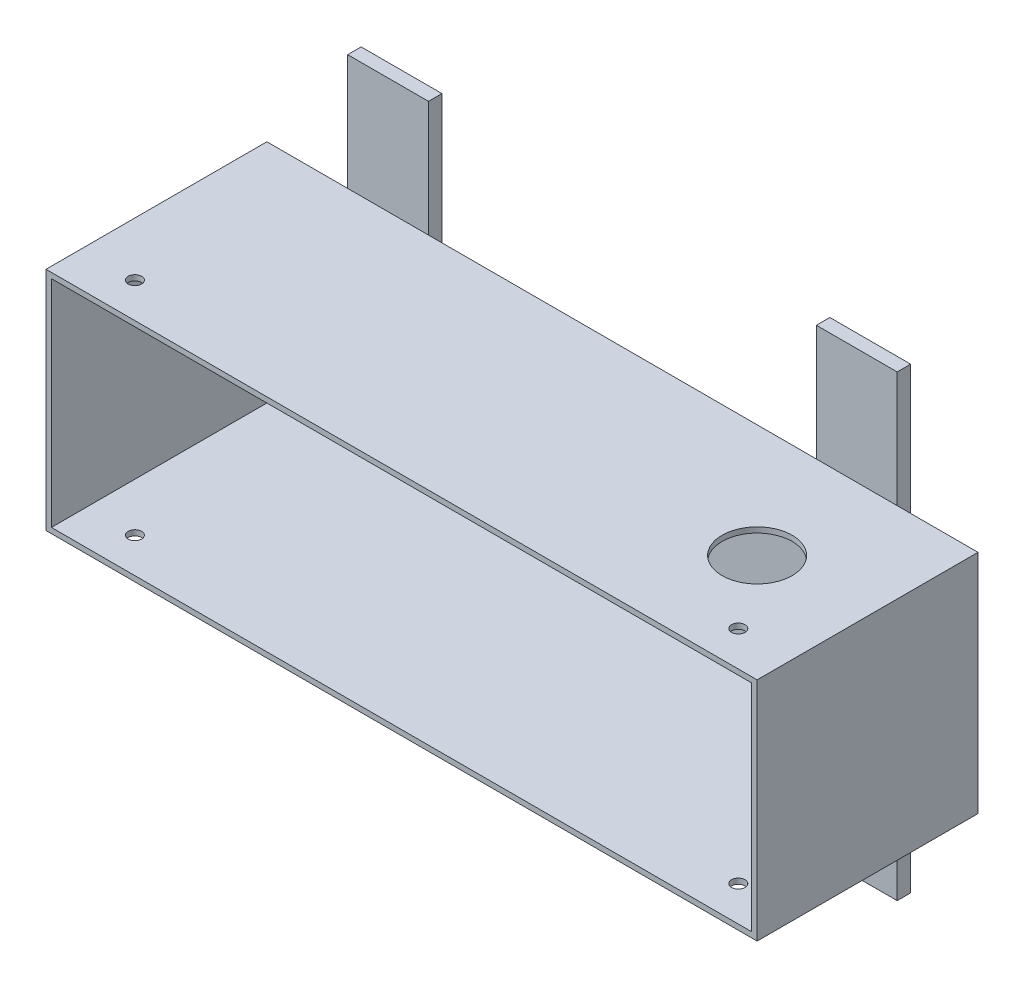
ISO-10303-21;
HEADER;
FILE_DESCRIPTION(('STEP AP214'),'2;1');
FILE_NAME('part.step','',(''),(''),'','','');
FILE_SCHEMA(('AUTOMOTIVE_DESIGN { 1 0 10303 214 1 1 1 1 }'));
ENDSEC;
DATA;
#1=APPLICATION_CONTEXT('core data for automotive mechanical design processes');
#2=APPLICATION_PROTOCOL_DEFINITION('international standard','automotive_design',2000,#1);
#3=PRODUCT_CONTEXT('',#1,'mechanical');
#4=PRODUCT('Part','Part','',(#3));
#5=PRODUCT_RELATED_PRODUCT_CATEGORY('part','',(#4));
#6=PRODUCT_DEFINITION_FORMATION('','',#4);
#7=PRODUCT_DEFINITION_CONTEXT('part definition',#1,'design');
#8=PRODUCT_DEFINITION('design','',#6,#7);
#9=PRODUCT_DEFINITION_SHAPE('','',#8);
#10=(LENGTH_UNIT() NAMED_UNIT(*) SI_UNIT(.MILLI.,.METRE.));
#11=(NAMED_UNIT(*) PLANE_ANGLE_UNIT() SI_UNIT($,.RADIAN.));
#12=(NAMED_UNIT(*) SI_UNIT($,.STERADIAN.) SOLID_ANGLE_UNIT());
#13=UNCERTAINTY_MEASURE_WITH_UNIT(LENGTH_MEASURE(1.E-05),#10,'distance_accuracy_value','');
#14=(GEOMETRIC_REPRESENTATION_CONTEXT(3) GLOBAL_UNCERTAINTY_ASSIGNED_CONTEXT((#13)) GLOBAL_UNIT_ASSIGNED_CONTEXT((#10,
#11,#12)) REPRESENTATION_CONTEXT('',''));
#15=CARTESIAN_POINT('',(0.,0.,0.));
#16=DIRECTION('',(0.,0.,1.));
#17=DIRECTION('',(1.,0.,0.));
#18=AXIS2_PLACEMENT_3D('',#15,#16,#17);
#19=CARTESIAN_POINT('',(0.,0.,-2.));
#20=DIRECTION('',(0.,0.,-1.));
#21=DIRECTION('',(-1.,0.,0.));
#22=AXIS2_PLACEMENT_3D('',#19,#20,#21);
#23=PLANE('',#22);
#24=DIRECTION('',(1.,0.,0.));
#25=VECTOR('',#24,1.);
#26=CARTESIAN_POINT('',(0.,-2.,-2.));
#27=LINE('',#26,#25);
#28=CARTESIAN_POINT('',(58.,-2.,-2.));
#29=VERTEX_POINT('',#28);
#30=CARTESIAN_POINT('',(202.,-2.,-2.));
#31=VERTEX_POINT('',#30);
#32=EDGE_CURVE('E290',#29,#31,#27,.T.);
#33=ORIENTED_EDGE('',*,*,#32,.F.);
#34=DIRECTION('',(0.,1.,0.));
#35=VECTOR('',#34,1.);
#36=CARTESIAN_POINT('',(58.,0.,-2.));
#37=LINE('',#36,#35);
#38=CARTESIAN_POINT('',(58.,82.,-2.));
#39=VERTEX_POINT('',#38);
#40=EDGE_CURVE('E11',#29,#39,#37,.T.);
#41=ORIENTED_EDGE('',*,*,#40,.T.);
#42=DIRECTION('',(-1.,0.,0.));
#43=VECTOR('',#42,1.);
#44=CARTESIAN_POINT('',(0.,82.,-2.));
#45=LINE('',#44,#43);
#46=CARTESIAN_POINT('',(202.,82.,-2.));
#47=VERTEX_POINT('',#46);
#48=EDGE_CURVE('E359',#47,#39,#45,.T.);
#49=ORIENTED_EDGE('',*,*,#48,.F.);
#50=DIRECTION('',(0.,1.,0.));
#51=VECTOR('',#50,1.);
#52=CARTESIAN_POINT('',(202.,125.,-2.));
#53=LINE('',#52,#51);
#54=EDGE_CURVE('E230',#31,#47,#53,.T.);
#55=ORIENTED_EDGE('',*,*,#54,.F.);
#56=EDGE_LOOP('',(#33,#41,#49,#55));
#57=FACE_BOUND('',#56,.T.);
#58=ADVANCED_FACE('F40',(#57),#23,.T.);
#59=CARTESIAN_POINT('',(28.,82.,-2.));
#60=VERTEX_POINT('',#59);
#61=CARTESIAN_POINT('',(-2.,82.,-2.));
#62=VERTEX_POINT('',#61);
#63=EDGE_CURVE('E295',#60,#62,#45,.T.);
#64=ORIENTED_EDGE('',*,*,#63,.F.);
#65=DIRECTION('',(0.,-1.,0.));
#66=VECTOR('',#65,1.);
#67=CARTESIAN_POINT('',(28.,0.,-2.));
#68=LINE('',#67,#66);
#69=CARTESIAN_POINT('',(28.,-2.,-2.));
#70=VERTEX_POINT('',#69);
#71=EDGE_CURVE('E47',#60,#70,#68,.T.);
#72=ORIENTED_EDGE('',*,*,#71,.T.);
#73=CARTESIAN_POINT('',(-2.,-2.,-2.));
#74=VERTEX_POINT('',#73);
#75=EDGE_CURVE('E285',#74,#70,#27,.T.);
#76=ORIENTED_EDGE('',*,*,#75,.F.);
#77=DIRECTION('',(0.,-1.,0.));
#78=VECTOR('',#77,1.);
#79=CARTESIAN_POINT('',(-2.,0.,-2.));
#80=LINE('',#79,#78);
#81=EDGE_CURVE('E273',#62,#74,#80,.T.);
#82=ORIENTED_EDGE('',*,*,#81,.F.);
#83=EDGE_LOOP('',(#64,#72,#76,#82));
#84=FACE_BOUND('',#83,.T.);
#85=ADVANCED_FACE('F371',(#84),#23,.T.);
#86=DIRECTION('',(0.,-1.,0.));
#87=VECTOR('',#86,1.);
#88=CARTESIAN_POINT('',(232.,125.,-2.));
#89=LINE('',#88,#87);
#90=CARTESIAN_POINT('',(232.,82.,-2.));
#91=VERTEX_POINT('',#90);
#92=CARTESIAN_POINT('',(232.,-2.,-2.));
#93=VERTEX_POINT('',#92);
#94=EDGE_CURVE('E207',#91,#93,#89,.T.);
#95=ORIENTED_EDGE('',*,*,#94,.F.);
#96=CARTESIAN_POINT('',(262.,82.,-2.));
#97=VERTEX_POINT('',#96);
#98=EDGE_CURVE('E298',#97,#91,#45,.T.);
#99=ORIENTED_EDGE('',*,*,#98,.F.);
#100=DIRECTION('',(0.,1.,0.));
#101=VECTOR('',#100,1.);
#102=CARTESIAN_POINT('',(262.,0.,-2.));
#103=LINE('',#102,#101);
#104=CARTESIAN_POINT('',(262.,-2.,-2.));
#105=VERTEX_POINT('',#104);
#106=EDGE_CURVE('E288',#105,#97,#103,.T.);
#107=ORIENTED_EDGE('',*,*,#106,.F.);
#108=EDGE_CURVE('E62',#93,#105,#27,.T.);
#109=ORIENTED_EDGE('',*,*,#108,.F.);
#110=EDGE_LOOP('',(#95,#99,#107,#109));
#111=FACE_BOUND('',#110,.T.);
#112=ADVANCED_FACE('F379',(#111),#23,.T.);
#113=CARTESIAN_POINT('',(0.,0.,80.));
#114=DIRECTION('',(0.,0.,-1.));
#115=DIRECTION('',(-1.,0.,0.));
#116=AXIS2_PLACEMENT_3D('',#113,#114,#115);
#117=PLANE('',#116);
#118=DIRECTION('',(0.,-1.,0.));
#119=VECTOR('',#118,1.);
#120=CARTESIAN_POINT('',(-2.,0.,80.));
#121=LINE('',#120,#119);
#122=CARTESIAN_POINT('',(-2.,82.,80.));
#123=VERTEX_POINT('',#122);
#124=CARTESIAN_POINT('',(-2.,-2.,80.));
#125=VERTEX_POINT('',#124);
#126=EDGE_CURVE('E301',#123,#125,#121,.T.);
#127=ORIENTED_EDGE('',*,*,#126,.T.);
#128=DIRECTION('',(1.,0.,0.));
#129=VECTOR('',#128,1.);
#130=CARTESIAN_POINT('',(0.,-2.,80.));
#131=LINE('',#130,#129);
#132=CARTESIAN_POINT('',(262.,-2.,80.));
#133=VERTEX_POINT('',#132);
#134=EDGE_CURVE('E305',#125,#133,#131,.T.);
#135=ORIENTED_EDGE('',*,*,#134,.T.);
#136=DIRECTION('',(0.,1.,0.));
#137=VECTOR('',#136,1.);
#138=CARTESIAN_POINT('',(262.,0.,80.));
#139=LINE('',#138,#137);
#140=CARTESIAN_POINT('',(262.,82.,80.));
#141=VERTEX_POINT('',#140);
#142=EDGE_CURVE('E307',#133,#141,#139,.T.);
#143=ORIENTED_EDGE('',*,*,#142,.T.);
#144=DIRECTION('',(-1.,0.,0.));
#145=VECTOR('',#144,1.);
#146=CARTESIAN_POINT('',(0.,82.,80.));
#147=LINE('',#146,#145);
#148=EDGE_CURVE('E284',#141,#123,#147,.T.);
#149=ORIENTED_EDGE('',*,*,#148,.T.);
#150=EDGE_LOOP('',(#127,#135,#143,#149));
#151=FACE_BOUND('',#150,.T.);
#152=DIRECTION('',(0.,-1.,0.));
#153=VECTOR('',#152,1.);
#154=CARTESIAN_POINT('',(0.,0.,80.));
#155=LINE('',#154,#153);
#156=CARTESIAN_POINT('',(0.,80.,80.));
#157=VERTEX_POINT('',#156);
#158=CARTESIAN_POINT('',(0.,0.,80.));
#159=VERTEX_POINT('',#158);
#160=EDGE_CURVE('E244',#157,#159,#155,.T.);
#161=ORIENTED_EDGE('',*,*,#160,.F.);
#162=DIRECTION('',(-1.,0.,0.));
#163=VECTOR('',#162,1.);
#164=CARTESIAN_POINT('',(0.,80.,80.));
#165=LINE('',#164,#163);
#166=CARTESIAN_POINT('',(260.,80.,80.));
#167=VERTEX_POINT('',#166);
#168=EDGE_CURVE('E252',#167,#157,#165,.T.);
#169=ORIENTED_EDGE('',*,*,#168,.F.);
#170=DIRECTION('',(0.,1.,0.));
#171=VECTOR('',#170,1.);
#172=CARTESIAN_POINT('',(260.,0.,80.));
#173=LINE('',#172,#171);
#174=CARTESIAN_POINT('',(260.,0.,80.));
#175=VERTEX_POINT('',#174);
#176=EDGE_CURVE('E249',#175,#167,#173,.T.);
#177=ORIENTED_EDGE('',*,*,#176,.F.);
#178=DIRECTION('',(1.,0.,0.));
#179=VECTOR('',#178,1.);
#180=CARTESIAN_POINT('',(0.,0.,80.));
#181=LINE('',#180,#179);
#182=EDGE_CURVE('E246',#159,#175,#181,.T.);
#183=ORIENTED_EDGE('',*,*,#182,.F.);
#184=EDGE_LOOP('',(#161,#169,#177,#183));
#185=FACE_BOUND('',#184,.T.);
#186=ADVANCED_FACE('F374',(#151,#185),#117,.F.);
#187=CARTESIAN_POINT('',(-2.,0.,80.));
#188=DIRECTION('',(1.,0.,0.));
#189=DIRECTION('',(0.,0.,-1.));
#190=AXIS2_PLACEMENT_3D('',#187,#188,#189);
#191=PLANE('',#190);
#192=ORIENTED_EDGE('',*,*,#81,.T.);
#193=DIRECTION('',(0.,0.,-1.));
#194=VECTOR('',#193,1.);
#195=CARTESIAN_POINT('',(-2.,-2.,80.));
#196=LINE('',#195,#194);
#197=EDGE_CURVE('E276',#125,#74,#196,.T.);
#198=ORIENTED_EDGE('',*,*,#197,.F.);
#199=ORIENTED_EDGE('',*,*,#126,.F.);
#200=DIRECTION('',(0.,0.,-1.));
#201=VECTOR('',#200,1.);
#202=CARTESIAN_POINT('',(-2.,82.,80.));
#203=LINE('',#202,#201);
#204=EDGE_CURVE('E280',#123,#62,#203,.T.);
#205=ORIENTED_EDGE('',*,*,#204,.T.);
#206=EDGE_LOOP('',(#192,#198,#199,#205));
#207=FACE_BOUND('',#206,.T.);
#208=ADVANCED_FACE('F369',(#207),#191,.F.);
#209=CARTESIAN_POINT('',(0.,-2.,80.));
#210=DIRECTION('',(0.,1.,0.));
#211=DIRECTION('',(0.,0.,1.));
#212=AXIS2_PLACEMENT_3D('',#209,#210,#211);
#213=PLANE('',#212);
#214=CARTESIAN_POINT('',(18.,-2.,67.));
#215=DIRECTION('',(0.,1.,0.));
#216=DIRECTION('',(0.,0.,1.));
#217=AXIS2_PLACEMENT_3D('',#214,#215,#216);
#218=CIRCLE('',#217,2.5);
#219=CARTESIAN_POINT('',(18.,-2.,69.5));
#220=VERTEX_POINT('',#219);
#221=EDGE_CURVE('E498',#220,#220,#218,.T.);
#222=ORIENTED_EDGE('',*,*,#221,.T.);
#223=EDGE_LOOP('',(#222));
#224=FACE_BOUND('',#223,.T.);
#225=CARTESIAN_POINT('',(242.,-2.,67.));
#226=DIRECTION('',(0.,1.,0.));
#227=DIRECTION('',(0.,0.,1.));
#228=AXIS2_PLACEMENT_3D('',#225,#226,#227);
#229=CIRCLE('',#228,2.5);
#230=CARTESIAN_POINT('',(242.,-2.,69.5));
#231=VERTEX_POINT('',#230);
#232=EDGE_CURVE('E500',#231,#231,#229,.T.);
#233=ORIENTED_EDGE('',*,*,#232,.T.);
#234=EDGE_LOOP('',(#233));
#235=FACE_BOUND('',#234,.T.);
#236=ORIENTED_EDGE('',*,*,#75,.T.);
#237=EDGE_CURVE('E289',#70,#29,#27,.T.);
#238=ORIENTED_EDGE('',*,*,#237,.T.);
#239=ORIENTED_EDGE('',*,*,#32,.T.);
#240=EDGE_CURVE('E291',#31,#93,#27,.T.);
#241=ORIENTED_EDGE('',*,*,#240,.T.);
#242=ORIENTED_EDGE('',*,*,#108,.T.);
#243=DIRECTION('',(0.,0.,-1.));
#244=VECTOR('',#243,1.);
#245=CARTESIAN_POINT('',(262.,-2.,80.));
#246=LINE('',#245,#244);
#247=EDGE_CURVE('E279',#133,#105,#246,.T.);
#248=ORIENTED_EDGE('',*,*,#247,.F.);
#249=ORIENTED_EDGE('',*,*,#134,.F.);
#250=ORIENTED_EDGE('',*,*,#197,.T.);
#251=EDGE_LOOP('',(#236,#238,#239,#241,#242,#248,#249,#250));
#252=FACE_BOUND('',#251,.T.);
#253=ADVANCED_FACE('F346',(#224,#235,#252),#213,.F.);
#254=CARTESIAN_POINT('',(262.,0.,80.));
#255=DIRECTION('',(-1.,0.,0.));
#256=DIRECTION('',(0.,0.,1.));
#257=AXIS2_PLACEMENT_3D('',#254,#255,#256);
#258=PLANE('',#257);
#259=ORIENTED_EDGE('',*,*,#106,.T.);
#260=DIRECTION('',(0.,0.,-1.));
#261=VECTOR('',#260,1.);
#262=CARTESIAN_POINT('',(262.,82.,80.));
#263=LINE('',#262,#261);
#264=EDGE_CURVE('E283',#141,#97,#263,.T.);
#265=ORIENTED_EDGE('',*,*,#264,.F.);
#266=ORIENTED_EDGE('',*,*,#142,.F.);
#267=ORIENTED_EDGE('',*,*,#247,.T.);
#268=EDGE_LOOP('',(#259,#265,#266,#267));
#269=FACE_BOUND('',#268,.T.);
#270=ADVANCED_FACE('F380',(#269),#258,.F.);
#271=CARTESIAN_POINT('',(0.,82.,80.));
#272=DIRECTION('',(0.,-1.,0.));
#273=DIRECTION('',(0.,0.,-1.));
#274=AXIS2_PLACEMENT_3D('',#271,#272,#273);
#275=PLANE('',#274);
#276=CARTESIAN_POINT('',(18.,82.,67.));
#277=DIRECTION('',(0.,1.,0.));
#278=DIRECTION('',(0.,0.,1.));
#279=AXIS2_PLACEMENT_3D('',#276,#277,#278);
#280=CIRCLE('',#279,2.5);
#281=CARTESIAN_POINT('',(18.,82.,69.5));
#282=VERTEX_POINT('',#281);
#283=EDGE_CURVE('E509',#282,#282,#280,.T.);
#284=ORIENTED_EDGE('',*,*,#283,.F.);
#285=EDGE_LOOP('',(#284));
#286=FACE_BOUND('',#285,.T.);
#287=CARTESIAN_POINT('',(242.,82.,67.));
#288=DIRECTION('',(0.,1.,0.));
#289=DIRECTION('',(0.,0.,1.));
#290=AXIS2_PLACEMENT_3D('',#287,#288,#289);
#291=CIRCLE('',#290,2.5);
#292=CARTESIAN_POINT('',(242.,82.,69.5));
#293=VERTEX_POINT('',#292);
#294=EDGE_CURVE('E508',#293,#293,#291,.T.);
#295=ORIENTED_EDGE('',*,*,#294,.F.);
#296=EDGE_LOOP('',(#295));
#297=FACE_BOUND('',#296,.T.);
#298=CARTESIAN_POINT('',(222.,82.,40.));
#299=DIRECTION('',(0.,1.,0.));
#300=DIRECTION('',(0.,0.,1.));
#301=AXIS2_PLACEMENT_3D('',#298,#299,#300);
#302=CIRCLE('',#301,13.);
#303=CARTESIAN_POINT('',(222.,82.,53.));
#304=VERTEX_POINT('',#303);
#305=EDGE_CURVE('E516',#304,#304,#302,.T.);
#306=ORIENTED_EDGE('',*,*,#305,.F.);
#307=EDGE_LOOP('',(#306));
#308=FACE_BOUND('',#307,.T.);
#309=ORIENTED_EDGE('',*,*,#98,.T.);
#310=EDGE_CURVE('E302',#91,#47,#45,.T.);
#311=ORIENTED_EDGE('',*,*,#310,.T.);
#312=ORIENTED_EDGE('',*,*,#48,.T.);
#313=EDGE_CURVE('E362',#39,#60,#45,.T.);
#314=ORIENTED_EDGE('',*,*,#313,.T.);
#315=ORIENTED_EDGE('',*,*,#63,.T.);
#316=ORIENTED_EDGE('',*,*,#204,.F.);
#317=ORIENTED_EDGE('',*,*,#148,.F.);
#318=ORIENTED_EDGE('',*,*,#264,.T.);
#319=EDGE_LOOP('',(#309,#311,#312,#314,#315,#316,#317,#318));
#320=FACE_BOUND('',#319,.T.);
#321=ADVANCED_FACE('F364',(#286,#297,#308,#320),#275,.F.);
#322=CARTESIAN_POINT('',(0.,0.,80.));
#323=DIRECTION('',(1.,0.,0.));
#324=DIRECTION('',(0.,0.,-1.));
#325=AXIS2_PLACEMENT_3D('',#322,#323,#324);
#326=PLANE('',#325);
#327=DIRECTION('',(0.,-1.,0.));
#328=VECTOR('',#327,1.);
#329=CARTESIAN_POINT('',(0.,0.,0.));
#330=LINE('',#329,#328);
#331=CARTESIAN_POINT('',(0.,80.,0.));
#332=VERTEX_POINT('',#331);
#333=CARTESIAN_POINT('',(0.,0.,0.));
#334=VERTEX_POINT('',#333);
#335=EDGE_CURVE('E243',#332,#334,#330,.T.);
#336=ORIENTED_EDGE('',*,*,#335,.F.);
#337=DIRECTION('',(0.,0.,-1.));
#338=VECTOR('',#337,1.);
#339=CARTESIAN_POINT('',(0.,80.,80.));
#340=LINE('',#339,#338);
#341=EDGE_CURVE('E254',#157,#332,#340,.T.);
#342=ORIENTED_EDGE('',*,*,#341,.F.);
#343=ORIENTED_EDGE('',*,*,#160,.T.);
#344=DIRECTION('',(0.,0.,-1.));
#345=VECTOR('',#344,1.);
#346=CARTESIAN_POINT('',(0.,0.,80.));
#347=LINE('',#346,#345);
#348=EDGE_CURVE('E270',#159,#334,#347,.T.);
#349=ORIENTED_EDGE('',*,*,#348,.T.);
#350=EDGE_LOOP('',(#336,#342,#343,#349));
#351=FACE_BOUND('',#350,.T.);
#352=ADVANCED_FACE('F387',(#351),#326,.T.);
#353=CARTESIAN_POINT('',(0.,0.,80.));
#354=DIRECTION('',(0.,1.,0.));
#355=DIRECTION('',(0.,0.,1.));
#356=AXIS2_PLACEMENT_3D('',#353,#354,#355);
#357=PLANE('',#356);
#358=CARTESIAN_POINT('',(18.,0.,67.));
#359=DIRECTION('',(0.,1.,0.));
#360=DIRECTION('',(0.,0.,1.));
#361=AXIS2_PLACEMENT_3D('',#358,#359,#360);
#362=CIRCLE('',#361,2.5);
#363=CARTESIAN_POINT('',(18.,0.,69.5));
#364=VERTEX_POINT('',#363);
#365=EDGE_CURVE('E495',#364,#364,#362,.F.);
#366=ORIENTED_EDGE('',*,*,#365,.T.);
#367=EDGE_LOOP('',(#366));
#368=FACE_BOUND('',#367,.T.);
#369=CARTESIAN_POINT('',(242.,0.,67.));
#370=DIRECTION('',(0.,1.,0.));
#371=DIRECTION('',(0.,0.,1.));
#372=AXIS2_PLACEMENT_3D('',#369,#370,#371);
#373=CIRCLE('',#372,2.5);
#374=CARTESIAN_POINT('',(242.,0.,69.5));
#375=VERTEX_POINT('',#374);
#376=EDGE_CURVE('E499',#375,#375,#373,.F.);
#377=ORIENTED_EDGE('',*,*,#376,.T.);
#378=EDGE_LOOP('',(#377));
#379=FACE_BOUND('',#378,.T.);
#380=DIRECTION('',(1.,0.,0.));
#381=VECTOR('',#380,1.);
#382=CARTESIAN_POINT('',(0.,0.,0.));
#383=LINE('',#382,#381);
#384=CARTESIAN_POINT('',(260.,0.,0.));
#385=VERTEX_POINT('',#384);
#386=EDGE_CURVE('E257',#334,#385,#383,.T.);
#387=ORIENTED_EDGE('',*,*,#386,.F.);
#388=ORIENTED_EDGE('',*,*,#348,.F.);
#389=ORIENTED_EDGE('',*,*,#182,.T.);
#390=DIRECTION('',(0.,0.,-1.));
#391=VECTOR('',#390,1.);
#392=CARTESIAN_POINT('',(260.,0.,80.));
#393=LINE('',#392,#391);
#394=EDGE_CURVE('E267',#175,#385,#393,.T.);
#395=ORIENTED_EDGE('',*,*,#394,.T.);
#396=EDGE_LOOP('',(#387,#388,#389,#395));
#397=FACE_BOUND('',#396,.T.);
#398=ADVANCED_FACE('F407',(#368,#379,#397),#357,.T.);
#399=CARTESIAN_POINT('',(260.,0.,80.));
#400=DIRECTION('',(-1.,0.,0.));
#401=DIRECTION('',(0.,0.,1.));
#402=AXIS2_PLACEMENT_3D('',#399,#400,#401);
#403=PLANE('',#402);
#404=DIRECTION('',(0.,1.,0.));
#405=VECTOR('',#404,1.);
#406=CARTESIAN_POINT('',(260.,0.,0.));
#407=LINE('',#406,#405);
#408=CARTESIAN_POINT('',(260.,80.,0.));
#409=VERTEX_POINT('',#408);
#410=EDGE_CURVE('E259',#385,#409,#407,.T.);
#411=ORIENTED_EDGE('',*,*,#410,.F.);
#412=ORIENTED_EDGE('',*,*,#394,.F.);
#413=ORIENTED_EDGE('',*,*,#176,.T.);
#414=DIRECTION('',(0.,0.,-1.));
#415=VECTOR('',#414,1.);
#416=CARTESIAN_POINT('',(260.,80.,80.));
#417=LINE('',#416,#415);
#418=EDGE_CURVE('E264',#167,#409,#417,.T.);
#419=ORIENTED_EDGE('',*,*,#418,.T.);
#420=EDGE_LOOP('',(#411,#412,#413,#419));
#421=FACE_BOUND('',#420,.T.);
#422=ADVANCED_FACE('F411',(#421),#403,.T.);
#423=CARTESIAN_POINT('',(0.,80.,80.));
#424=DIRECTION('',(0.,-1.,0.));
#425=DIRECTION('',(0.,0.,-1.));
#426=AXIS2_PLACEMENT_3D('',#423,#424,#425);
#427=PLANE('',#426);
#428=CARTESIAN_POINT('',(18.,80.,67.));
#429=DIRECTION('',(0.,-1.,0.));
#430=DIRECTION('',(0.,0.,-1.));
#431=AXIS2_PLACEMENT_3D('',#428,#429,#430);
#432=CIRCLE('',#431,2.5);
#433=CARTESIAN_POINT('',(18.,80.,64.5));
#434=VERTEX_POINT('',#433);
#435=EDGE_CURVE('E512',#434,#434,#432,.F.);
#436=ORIENTED_EDGE('',*,*,#435,.T.);
#437=EDGE_LOOP('',(#436));
#438=FACE_BOUND('',#437,.T.);
#439=CARTESIAN_POINT('',(242.,80.,67.));
#440=DIRECTION('',(0.,-1.,0.));
#441=DIRECTION('',(0.,0.,-1.));
#442=AXIS2_PLACEMENT_3D('',#439,#440,#441);
#443=CIRCLE('',#442,2.5);
#444=CARTESIAN_POINT('',(242.,80.,64.5));
#445=VERTEX_POINT('',#444);
#446=EDGE_CURVE('E513',#445,#445,#443,.F.);
#447=ORIENTED_EDGE('',*,*,#446,.T.);
#448=EDGE_LOOP('',(#447));
#449=FACE_BOUND('',#448,.T.);
#450=CARTESIAN_POINT('',(222.,80.,40.));
#451=DIRECTION('',(0.,-1.,0.));
#452=DIRECTION('',(0.,0.,-1.));
#453=AXIS2_PLACEMENT_3D('',#450,#451,#452);
#454=CIRCLE('',#453,13.);
#455=CARTESIAN_POINT('',(222.,80.,27.));
#456=VERTEX_POINT('',#455);
#457=EDGE_CURVE('E523',#456,#456,#454,.F.);
#458=ORIENTED_EDGE('',*,*,#457,.T.);
#459=EDGE_LOOP('',(#458));
#460=FACE_BOUND('',#459,.T.);
#461=DIRECTION('',(-1.,0.,0.));
#462=VECTOR('',#461,1.);
#463=CARTESIAN_POINT('',(0.,80.,0.));
#464=LINE('',#463,#462);
#465=EDGE_CURVE('E247',#409,#332,#464,.T.);
#466=ORIENTED_EDGE('',*,*,#465,.F.);
#467=ORIENTED_EDGE('',*,*,#418,.F.);
#468=ORIENTED_EDGE('',*,*,#168,.T.);
#469=ORIENTED_EDGE('',*,*,#341,.T.);
#470=EDGE_LOOP('',(#466,#467,#468,#469));
#471=FACE_BOUND('',#470,.T.);
#472=ADVANCED_FACE('F415',(#438,#449,#460,#471),#427,.T.);
#473=CARTESIAN_POINT('',(0.,0.,0.));
#474=DIRECTION('',(0.,0.,-1.));
#475=DIRECTION('',(-1.,0.,0.));
#476=AXIS2_PLACEMENT_3D('',#473,#474,#475);
#477=PLANE('',#476);
#478=CARTESIAN_POINT('',(43.,66.,0.));
#479=DIRECTION('',(0.,0.,-1.));
#480=DIRECTION('',(-1.,0.,0.));
#481=AXIS2_PLACEMENT_3D('',#478,#479,#480);
#482=CIRCLE('',#481,4.99999999999999);
#483=CARTESIAN_POINT('',(38.,66.,0.));
#484=VERTEX_POINT('',#483);
#485=EDGE_CURVE('E530',#484,#484,#482,.T.);
#486=ORIENTED_EDGE('',*,*,#485,.T.);
#487=EDGE_LOOP('',(#486));
#488=FACE_BOUND('',#487,.T.);
#489=CARTESIAN_POINT('',(43.,14.,0.));
#490=DIRECTION('',(0.,0.,-1.));
#491=DIRECTION('',(-1.,0.,0.));
#492=AXIS2_PLACEMENT_3D('',#489,#490,#491);
#493=CIRCLE('',#492,4.99999999999999);
#494=CARTESIAN_POINT('',(38.,14.,0.));
#495=VERTEX_POINT('',#494);
#496=EDGE_CURVE('E531',#495,#495,#493,.T.);
#497=ORIENTED_EDGE('',*,*,#496,.T.);
#498=EDGE_LOOP('',(#497));
#499=FACE_BOUND('',#498,.T.);
#500=CARTESIAN_POINT('',(217.,66.,0.));
#501=DIRECTION('',(0.,0.,-1.));
#502=DIRECTION('',(-1.,0.,0.));
#503=AXIS2_PLACEMENT_3D('',#500,#501,#502);
#504=CIRCLE('',#503,4.99999999999999);
#505=CARTESIAN_POINT('',(212.,66.,0.));
#506=VERTEX_POINT('',#505);
#507=EDGE_CURVE('E542',#506,#506,#504,.F.);
#508=ORIENTED_EDGE('',*,*,#507,.F.);
#509=EDGE_LOOP('',(#508));
#510=FACE_BOUND('',#509,.T.);
#511=CARTESIAN_POINT('',(217.,14.,0.));
#512=DIRECTION('',(0.,0.,-1.));
#513=DIRECTION('',(-1.,0.,0.));
#514=AXIS2_PLACEMENT_3D('',#511,#512,#513);
#515=CIRCLE('',#514,4.99999999999999);
#516=CARTESIAN_POINT('',(212.,14.,0.));
#517=VERTEX_POINT('',#516);
#518=EDGE_CURVE('E543',#517,#517,#515,.F.);
#519=ORIENTED_EDGE('',*,*,#518,.F.);
#520=EDGE_LOOP('',(#519));
#521=FACE_BOUND('',#520,.T.);
#522=ORIENTED_EDGE('',*,*,#335,.T.);
#523=ORIENTED_EDGE('',*,*,#386,.T.);
#524=ORIENTED_EDGE('',*,*,#410,.T.);
#525=ORIENTED_EDGE('',*,*,#465,.T.);
#526=EDGE_LOOP('',(#522,#523,#524,#525));
#527=FACE_BOUND('',#526,.T.);
#528=ADVANCED_FACE('F419',(#488,#499,#510,#521,#527),#477,.F.);
#529=CARTESIAN_POINT('',(0.,0.,-2.));
#530=DIRECTION('',(0.,0.,-1.));
#531=DIRECTION('',(-1.,0.,0.));
#532=AXIS2_PLACEMENT_3D('',#529,#530,#531);
#533=PLANE('',#532);
#534=ORIENTED_EDGE('',*,*,#310,.F.);
#535=CARTESIAN_POINT('',(232.,125.,-2.));
#536=VERTEX_POINT('',#535);
#537=EDGE_CURVE('E205',#536,#91,#89,.T.);
#538=ORIENTED_EDGE('',*,*,#537,.F.);
#539=DIRECTION('',(1.,0.,0.));
#540=VECTOR('',#539,1.);
#541=CARTESIAN_POINT('',(232.,125.,-2.));
#542=LINE('',#541,#540);
#543=CARTESIAN_POINT('',(202.,125.,-2.));
#544=VERTEX_POINT('',#543);
#545=EDGE_CURVE('E216',#544,#536,#542,.T.);
#546=ORIENTED_EDGE('',*,*,#545,.F.);
#547=EDGE_CURVE('E226',#47,#544,#53,.T.);
#548=ORIENTED_EDGE('',*,*,#547,.F.);
#549=EDGE_LOOP('',(#534,#538,#546,#548));
#550=FACE_BOUND('',#549,.T.);
#551=ADVANCED_FACE('F329',(#550),#533,.F.);
#552=CARTESIAN_POINT('',(232.,125.,-7.));
#553=DIRECTION('',(-1.,0.,0.));
#554=DIRECTION('',(0.,0.,1.));
#555=AXIS2_PLACEMENT_3D('',#552,#553,#554);
#556=PLANE('',#555);
#557=ORIENTED_EDGE('',*,*,#537,.T.);
#558=ORIENTED_EDGE('',*,*,#94,.T.);
#559=CARTESIAN_POINT('',(232.,-45.,-2.));
#560=VERTEX_POINT('',#559);
#561=EDGE_CURVE('E203',#93,#560,#89,.T.);
#562=ORIENTED_EDGE('',*,*,#561,.T.);
#563=DIRECTION('',(0.,0.,1.));
#564=VECTOR('',#563,1.);
#565=CARTESIAN_POINT('',(232.,-45.,-7.));
#566=LINE('',#565,#564);
#567=CARTESIAN_POINT('',(232.,-45.,-7.));
#568=VERTEX_POINT('',#567);
#569=EDGE_CURVE('E240',#568,#560,#566,.T.);
#570=ORIENTED_EDGE('',*,*,#569,.F.);
#571=DIRECTION('',(0.,-1.,0.));
#572=VECTOR('',#571,1.);
#573=CARTESIAN_POINT('',(232.,125.,-7.));
#574=LINE('',#573,#572);
#575=CARTESIAN_POINT('',(232.,125.,-7.));
#576=VERTEX_POINT('',#575);
#577=EDGE_CURVE('E212',#576,#568,#574,.T.);
#578=ORIENTED_EDGE('',*,*,#577,.F.);
#579=DIRECTION('',(0.,0.,1.));
#580=VECTOR('',#579,1.);
#581=CARTESIAN_POINT('',(232.,125.,-7.));
#582=LINE('',#581,#580);
#583=EDGE_CURVE('E221',#576,#536,#582,.T.);
#584=ORIENTED_EDGE('',*,*,#583,.T.);
#585=EDGE_LOOP('',(#557,#558,#562,#570,#578,#584));
#586=FACE_BOUND('',#585,.T.);
#587=ADVANCED_FACE('F330',(#586),#556,.F.);
#588=CARTESIAN_POINT('',(232.,-45.,-7.));
#589=DIRECTION('',(0.,1.,0.));
#590=DIRECTION('',(0.,0.,1.));
#591=AXIS2_PLACEMENT_3D('',#588,#589,#590);
#592=PLANE('',#591);
#593=DIRECTION('',(-1.,0.,0.));
#594=VECTOR('',#593,1.);
#595=CARTESIAN_POINT('',(232.,-45.,-2.));
#596=LINE('',#595,#594);
#597=CARTESIAN_POINT('',(202.,-45.,-2.));
#598=VERTEX_POINT('',#597);
#599=EDGE_CURVE('E224',#560,#598,#596,.T.);
#600=ORIENTED_EDGE('',*,*,#599,.T.);
#601=DIRECTION('',(0.,0.,1.));
#602=VECTOR('',#601,1.);
#603=CARTESIAN_POINT('',(202.,-45.,-7.));
#604=LINE('',#603,#602);
#605=CARTESIAN_POINT('',(202.,-45.,-7.));
#606=VERTEX_POINT('',#605);
#607=EDGE_CURVE('E237',#606,#598,#604,.T.);
#608=ORIENTED_EDGE('',*,*,#607,.F.);
#609=DIRECTION('',(-1.,0.,0.));
#610=VECTOR('',#609,1.);
#611=CARTESIAN_POINT('',(232.,-45.,-7.));
#612=LINE('',#611,#610);
#613=EDGE_CURVE('E215',#568,#606,#612,.T.);
#614=ORIENTED_EDGE('',*,*,#613,.F.);
#615=ORIENTED_EDGE('',*,*,#569,.T.);
#616=EDGE_LOOP('',(#600,#608,#614,#615));
#617=FACE_BOUND('',#616,.T.);
#618=ADVANCED_FACE('F426',(#617),#592,.F.);
#619=CARTESIAN_POINT('',(202.,125.,-7.));
#620=DIRECTION('',(1.,0.,0.));
#621=DIRECTION('',(0.,0.,-1.));
#622=AXIS2_PLACEMENT_3D('',#619,#620,#621);
#623=PLANE('',#622);
#624=EDGE_CURVE('E227',#598,#31,#53,.T.);
#625=ORIENTED_EDGE('',*,*,#624,.T.);
#626=ORIENTED_EDGE('',*,*,#54,.T.);
#627=ORIENTED_EDGE('',*,*,#547,.T.);
#628=DIRECTION('',(0.,0.,1.));
#629=VECTOR('',#628,1.);
#630=CARTESIAN_POINT('',(202.,125.,-7.));
#631=LINE('',#630,#629);
#632=CARTESIAN_POINT('',(202.,125.,-7.));
#633=VERTEX_POINT('',#632);
#634=EDGE_CURVE('E234',#633,#544,#631,.T.);
#635=ORIENTED_EDGE('',*,*,#634,.F.);
#636=DIRECTION('',(0.,1.,0.));
#637=VECTOR('',#636,1.);
#638=CARTESIAN_POINT('',(202.,125.,-7.));
#639=LINE('',#638,#637);
#640=EDGE_CURVE('E218',#606,#633,#639,.T.);
#641=ORIENTED_EDGE('',*,*,#640,.F.);
#642=ORIENTED_EDGE('',*,*,#607,.T.);
#643=EDGE_LOOP('',(#625,#626,#627,#635,#641,#642));
#644=FACE_BOUND('',#643,.T.);
#645=ADVANCED_FACE('F319',(#644),#623,.F.);
#646=CARTESIAN_POINT('',(232.,125.,-7.));
#647=DIRECTION('',(0.,-1.,0.));
#648=DIRECTION('',(0.,0.,-1.));
#649=AXIS2_PLACEMENT_3D('',#646,#647,#648);
#650=PLANE('',#649);
#651=ORIENTED_EDGE('',*,*,#545,.T.);
#652=ORIENTED_EDGE('',*,*,#583,.F.);
#653=DIRECTION('',(1.,0.,0.));
#654=VECTOR('',#653,1.);
#655=CARTESIAN_POINT('',(232.,125.,-7.));
#656=LINE('',#655,#654);
#657=EDGE_CURVE('E220',#633,#576,#656,.T.);
#658=ORIENTED_EDGE('',*,*,#657,.F.);
#659=ORIENTED_EDGE('',*,*,#634,.T.);
#660=EDGE_LOOP('',(#651,#652,#658,#659));
#661=FACE_BOUND('',#660,.T.);
#662=ADVANCED_FACE('F326',(#661),#650,.F.);
#663=CARTESIAN_POINT('',(0.,0.,-7.));
#664=DIRECTION('',(0.,0.,-1.));
#665=DIRECTION('',(-1.,0.,0.));
#666=AXIS2_PLACEMENT_3D('',#663,#664,#665);
#667=PLANE('',#666);
#668=CARTESIAN_POINT('',(217.,66.,-7.));
#669=DIRECTION('',(0.,0.,-1.));
#670=DIRECTION('',(-1.,0.,0.));
#671=AXIS2_PLACEMENT_3D('',#668,#669,#670);
#672=CIRCLE('',#671,4.99999999999999);
#673=CARTESIAN_POINT('',(212.,66.,-7.));
#674=VERTEX_POINT('',#673);
#675=EDGE_CURVE('E539',#674,#674,#672,.T.);
#676=ORIENTED_EDGE('',*,*,#675,.F.);
#677=EDGE_LOOP('',(#676));
#678=FACE_BOUND('',#677,.T.);
#679=CARTESIAN_POINT('',(217.,14.,-7.));
#680=DIRECTION('',(0.,0.,-1.));
#681=DIRECTION('',(-1.,0.,0.));
#682=AXIS2_PLACEMENT_3D('',#679,#680,#681);
#683=CIRCLE('',#682,4.99999999999999);
#684=CARTESIAN_POINT('',(212.,14.,-7.));
#685=VERTEX_POINT('',#684);
#686=EDGE_CURVE('E534',#685,#685,#683,.T.);
#687=ORIENTED_EDGE('',*,*,#686,.F.);
#688=EDGE_LOOP('',(#687));
#689=FACE_BOUND('',#688,.T.);
#690=ORIENTED_EDGE('',*,*,#577,.T.);
#691=ORIENTED_EDGE('',*,*,#613,.T.);
#692=ORIENTED_EDGE('',*,*,#640,.T.);
#693=ORIENTED_EDGE('',*,*,#657,.T.);
#694=EDGE_LOOP('',(#690,#691,#692,#693));
#695=FACE_BOUND('',#694,.T.);
#696=ADVANCED_FACE('F334',(#678,#689,#695),#667,.T.);
#697=ORIENTED_EDGE('',*,*,#240,.F.);
#698=ORIENTED_EDGE('',*,*,#624,.F.);
#699=ORIENTED_EDGE('',*,*,#599,.F.);
#700=ORIENTED_EDGE('',*,*,#561,.F.);
#701=EDGE_LOOP('',(#697,#698,#699,#700));
#702=FACE_BOUND('',#701,.T.);
#703=ADVANCED_FACE('F341',(#702),#533,.F.);
#704=CARTESIAN_POINT('',(0.,0.,-2.));
#705=DIRECTION('',(0.,0.,-1.));
#706=DIRECTION('',(-1.,0.,0.));
#707=AXIS2_PLACEMENT_3D('',#704,#705,#706);
#708=PLANE('',#707);
#709=DIRECTION('',(0.,-1.,0.));
#710=VECTOR('',#709,1.);
#711=CARTESIAN_POINT('',(58.,125.,-2.));
#712=LINE('',#711,#710);
#713=CARTESIAN_POINT('',(58.,-45.,-2.));
#714=VERTEX_POINT('',#713);
#715=EDGE_CURVE('E351',#29,#714,#712,.T.);
#716=ORIENTED_EDGE('',*,*,#715,.F.);
#717=ORIENTED_EDGE('',*,*,#237,.F.);
#718=DIRECTION('',(0.,1.,0.));
#719=VECTOR('',#718,1.);
#720=CARTESIAN_POINT('',(28.,125.,-2.));
#721=LINE('',#720,#719);
#722=CARTESIAN_POINT('',(28.,-45.,-2.));
#723=VERTEX_POINT('',#722);
#724=EDGE_CURVE('E54',#723,#70,#721,.T.);
#725=ORIENTED_EDGE('',*,*,#724,.F.);
#726=DIRECTION('',(-1.,0.,0.));
#727=VECTOR('',#726,1.);
#728=CARTESIAN_POINT('',(28.,-45.,-2.));
#729=LINE('',#728,#727);
#730=EDGE_CURVE('E353',#714,#723,#729,.T.);
#731=ORIENTED_EDGE('',*,*,#730,.F.);
#732=EDGE_LOOP('',(#716,#717,#725,#731));
#733=FACE_BOUND('',#732,.T.);
#734=ADVANCED_FACE('F349',(#733),#708,.F.);
#735=CARTESIAN_POINT('',(28.,125.,-2.));
#736=VERTEX_POINT('',#735);
#737=EDGE_CURVE('E555',#60,#736,#721,.T.);
#738=ORIENTED_EDGE('',*,*,#737,.F.);
#739=ORIENTED_EDGE('',*,*,#313,.F.);
#740=CARTESIAN_POINT('',(58.,125.,-2.));
#741=VERTEX_POINT('',#740);
#742=EDGE_CURVE('E354',#741,#39,#712,.T.);
#743=ORIENTED_EDGE('',*,*,#742,.F.);
#744=DIRECTION('',(1.,0.,0.));
#745=VECTOR('',#744,1.);
#746=CARTESIAN_POINT('',(28.,125.,-2.));
#747=LINE('',#746,#745);
#748=EDGE_CURVE('E202',#736,#741,#747,.T.);
#749=ORIENTED_EDGE('',*,*,#748,.F.);
#750=EDGE_LOOP('',(#738,#739,#743,#749));
#751=FACE_BOUND('',#750,.T.);
#752=ADVANCED_FACE('F440',(#751),#708,.F.);
#753=CARTESIAN_POINT('',(28.,125.,-7.));
#754=DIRECTION('',(0.,-1.,0.));
#755=DIRECTION('',(1.,0.,0.));
#756=AXIS2_PLACEMENT_3D('',#753,#754,#755);
#757=PLANE('',#756);
#758=ORIENTED_EDGE('',*,*,#748,.T.);
#759=DIRECTION('',(0.,0.,1.));
#760=VECTOR('',#759,1.);
#761=CARTESIAN_POINT('',(58.,125.,-7.));
#762=LINE('',#761,#760);
#763=CARTESIAN_POINT('',(58.,125.,-7.));
#764=VERTEX_POINT('',#763);
#765=EDGE_CURVE('E183',#764,#741,#762,.T.);
#766=ORIENTED_EDGE('',*,*,#765,.F.);
#767=DIRECTION('',(1.,0.,0.));
#768=VECTOR('',#767,1.);
#769=CARTESIAN_POINT('',(28.,125.,-7.));
#770=LINE('',#769,#768);
#771=CARTESIAN_POINT('',(28.,125.,-7.));
#772=VERTEX_POINT('',#771);
#773=EDGE_CURVE('E190',#772,#764,#770,.T.);
#774=ORIENTED_EDGE('',*,*,#773,.F.);
#775=DIRECTION('',(0.,0.,1.));
#776=VECTOR('',#775,1.);
#777=CARTESIAN_POINT('',(28.,125.,-7.));
#778=LINE('',#777,#776);
#779=EDGE_CURVE('E552',#772,#736,#778,.T.);
#780=ORIENTED_EDGE('',*,*,#779,.T.);
#781=EDGE_LOOP('',(#758,#766,#774,#780));
#782=FACE_BOUND('',#781,.T.);
#783=ADVANCED_FACE('F200',(#782),#757,.F.);
#784=CARTESIAN_POINT('',(58.,125.,-7.));
#785=DIRECTION('',(-1.,0.,0.));
#786=DIRECTION('',(0.,0.,1.));
#787=AXIS2_PLACEMENT_3D('',#784,#785,#786);
#788=PLANE('',#787);
#789=ORIENTED_EDGE('',*,*,#742,.T.);
#790=ORIENTED_EDGE('',*,*,#40,.F.);
#791=ORIENTED_EDGE('',*,*,#715,.T.);
#792=DIRECTION('',(0.,0.,1.));
#793=VECTOR('',#792,1.);
#794=CARTESIAN_POINT('',(58.,-45.,-7.));
#795=LINE('',#794,#793);
#796=CARTESIAN_POINT('',(58.,-45.,-7.));
#797=VERTEX_POINT('',#796);
#798=EDGE_CURVE('E186',#797,#714,#795,.T.);
#799=ORIENTED_EDGE('',*,*,#798,.F.);
#800=DIRECTION('',(0.,-1.,0.));
#801=VECTOR('',#800,1.);
#802=CARTESIAN_POINT('',(58.,125.,-7.));
#803=LINE('',#802,#801);
#804=EDGE_CURVE('E178',#764,#797,#803,.T.);
#805=ORIENTED_EDGE('',*,*,#804,.F.);
#806=ORIENTED_EDGE('',*,*,#765,.T.);
#807=EDGE_LOOP('',(#789,#790,#791,#799,#805,#806));
#808=FACE_BOUND('',#807,.T.);
#809=ADVANCED_FACE('F181',(#808),#788,.F.);
#810=CARTESIAN_POINT('',(28.,-45.,-7.));
#811=DIRECTION('',(0.,1.,0.));
#812=DIRECTION('',(-1.,0.,0.));
#813=AXIS2_PLACEMENT_3D('',#810,#811,#812);
#814=PLANE('',#813);
#815=ORIENTED_EDGE('',*,*,#730,.T.);
#816=DIRECTION('',(0.,0.,1.));
#817=VECTOR('',#816,1.);
#818=CARTESIAN_POINT('',(28.,-45.,-7.));
#819=LINE('',#818,#817);
#820=CARTESIAN_POINT('',(28.,-45.,-7.));
#821=VERTEX_POINT('',#820);
#822=EDGE_CURVE('E208',#821,#723,#819,.T.);
#823=ORIENTED_EDGE('',*,*,#822,.F.);
#824=DIRECTION('',(-1.,0.,0.));
#825=VECTOR('',#824,1.);
#826=CARTESIAN_POINT('',(28.,-45.,-7.));
#827=LINE('',#826,#825);
#828=EDGE_CURVE('E189',#797,#821,#827,.T.);
#829=ORIENTED_EDGE('',*,*,#828,.F.);
#830=ORIENTED_EDGE('',*,*,#798,.T.);
#831=EDGE_LOOP('',(#815,#823,#829,#830));
#832=FACE_BOUND('',#831,.T.);
#833=ADVANCED_FACE('F443',(#832),#814,.F.);
#834=CARTESIAN_POINT('',(28.,125.,-7.));
#835=DIRECTION('',(1.,0.,0.));
#836=DIRECTION('',(0.,0.,-1.));
#837=AXIS2_PLACEMENT_3D('',#834,#835,#836);
#838=PLANE('',#837);
#839=ORIENTED_EDGE('',*,*,#724,.T.);
#840=ORIENTED_EDGE('',*,*,#71,.F.);
#841=ORIENTED_EDGE('',*,*,#737,.T.);
#842=ORIENTED_EDGE('',*,*,#779,.F.);
#843=DIRECTION('',(0.,1.,0.));
#844=VECTOR('',#843,1.);
#845=CARTESIAN_POINT('',(28.,125.,-7.));
#846=LINE('',#845,#844);
#847=EDGE_CURVE('E195',#821,#772,#846,.T.);
#848=ORIENTED_EDGE('',*,*,#847,.F.);
#849=ORIENTED_EDGE('',*,*,#822,.T.);
#850=EDGE_LOOP('',(#839,#840,#841,#842,#848,#849));
#851=FACE_BOUND('',#850,.T.);
#852=ADVANCED_FACE('F446',(#851),#838,.F.);
#853=CARTESIAN_POINT('',(0.,0.,-7.));
#854=DIRECTION('',(0.,0.,-1.));
#855=DIRECTION('',(-1.,0.,0.));
#856=AXIS2_PLACEMENT_3D('',#853,#854,#855);
#857=PLANE('',#856);
#858=CARTESIAN_POINT('',(43.,66.,-7.));
#859=DIRECTION('',(0.,0.,1.));
#860=DIRECTION('',(1.,0.,0.));
#861=AXIS2_PLACEMENT_3D('',#858,#859,#860);
#862=CIRCLE('',#861,4.99999999999999);
#863=CARTESIAN_POINT('',(48.,66.,-7.));
#864=VERTEX_POINT('',#863);
#865=EDGE_CURVE('E527',#864,#864,#862,.T.);
#866=ORIENTED_EDGE('',*,*,#865,.T.);
#867=EDGE_LOOP('',(#866));
#868=FACE_BOUND('',#867,.T.);
#869=CARTESIAN_POINT('',(43.,14.,-7.));
#870=DIRECTION('',(0.,0.,1.));
#871=DIRECTION('',(1.,0.,0.));
#872=AXIS2_PLACEMENT_3D('',#869,#870,#871);
#873=CIRCLE('',#872,4.99999999999999);
#874=CARTESIAN_POINT('',(48.,14.,-7.));
#875=VERTEX_POINT('',#874);
#876=EDGE_CURVE('E526',#875,#875,#873,.T.);
#877=ORIENTED_EDGE('',*,*,#876,.T.);
#878=EDGE_LOOP('',(#877));
#879=FACE_BOUND('',#878,.T.);
#880=ORIENTED_EDGE('',*,*,#773,.T.);
#881=ORIENTED_EDGE('',*,*,#804,.T.);
#882=ORIENTED_EDGE('',*,*,#828,.T.);
#883=ORIENTED_EDGE('',*,*,#847,.T.);
#884=EDGE_LOOP('',(#880,#881,#882,#883));
#885=FACE_BOUND('',#884,.T.);
#886=ADVANCED_FACE('F193',(#868,#879,#885),#857,.T.);
#887=CARTESIAN_POINT('',(217.,14.,14.1421356237309));
#888=DIRECTION('',(0.,0.,-1.));
#889=DIRECTION('',(-1.,0.,0.));
#890=AXIS2_PLACEMENT_3D('',#887,#888,#889);
#891=CYLINDRICAL_SURFACE('',#890,4.99999999999999);
#892=ORIENTED_EDGE('',*,*,#518,.T.);
#893=EDGE_LOOP('',(#892));
#894=FACE_BOUND('',#893,.T.);
#895=ORIENTED_EDGE('',*,*,#686,.T.);
#896=EDGE_LOOP('',(#895));
#897=FACE_BOUND('',#896,.T.);
#898=ADVANCED_FACE('F454',(#894,#897),#891,.F.);
#899=CARTESIAN_POINT('',(217.,66.,14.1421356237309));
#900=DIRECTION('',(0.,0.,-1.));
#901=DIRECTION('',(-1.,0.,0.));
#902=AXIS2_PLACEMENT_3D('',#899,#900,#901);
#903=CYLINDRICAL_SURFACE('',#902,4.99999999999999);
#904=ORIENTED_EDGE('',*,*,#507,.T.);
#905=EDGE_LOOP('',(#904));
#906=FACE_BOUND('',#905,.T.);
#907=ORIENTED_EDGE('',*,*,#675,.T.);
#908=EDGE_LOOP('',(#907));
#909=FACE_BOUND('',#908,.T.);
#910=ADVANCED_FACE('F458',(#906,#909),#903,.F.);
#911=CARTESIAN_POINT('',(43.,14.,14.1421356237309));
#912=DIRECTION('',(0.,0.,-1.));
#913=DIRECTION('',(-1.,0.,0.));
#914=AXIS2_PLACEMENT_3D('',#911,#912,#913);
#915=CYLINDRICAL_SURFACE('',#914,4.99999999999999);
#916=ORIENTED_EDGE('',*,*,#496,.F.);
#917=EDGE_LOOP('',(#916));
#918=FACE_BOUND('',#917,.T.);
#919=ORIENTED_EDGE('',*,*,#876,.F.);
#920=EDGE_LOOP('',(#919));
#921=FACE_BOUND('',#920,.T.);
#922=ADVANCED_FACE('F462',(#918,#921),#915,.F.);
#923=CARTESIAN_POINT('',(43.,66.,14.1421356237309));
#924=DIRECTION('',(0.,0.,-1.));
#925=DIRECTION('',(-1.,0.,0.));
#926=AXIS2_PLACEMENT_3D('',#923,#924,#925);
#927=CYLINDRICAL_SURFACE('',#926,4.99999999999999);
#928=ORIENTED_EDGE('',*,*,#485,.F.);
#929=EDGE_LOOP('',(#928));
#930=FACE_BOUND('',#929,.T.);
#931=ORIENTED_EDGE('',*,*,#865,.F.);
#932=EDGE_LOOP('',(#931));
#933=FACE_BOUND('',#932,.T.);
#934=ADVANCED_FACE('F466',(#930,#933),#927,.F.);
#935=CARTESIAN_POINT('',(222.,43.2304473782995,40.));
#936=DIRECTION('',(0.,1.,0.));
#937=DIRECTION('',(0.,0.,1.));
#938=AXIS2_PLACEMENT_3D('',#935,#936,#937);
#939=CYLINDRICAL_SURFACE('',#938,13.);
#940=ORIENTED_EDGE('',*,*,#305,.T.);
#941=EDGE_LOOP('',(#940));
#942=FACE_BOUND('',#941,.T.);
#943=ORIENTED_EDGE('',*,*,#457,.F.);
#944=EDGE_LOOP('',(#943));
#945=FACE_BOUND('',#944,.T.);
#946=ADVANCED_FACE('F470',(#942,#945),#939,.F.);
#947=CARTESIAN_POINT('',(242.,72.9289321881345,67.));
#948=DIRECTION('',(0.,1.,0.));
#949=DIRECTION('',(0.,0.,1.));
#950=AXIS2_PLACEMENT_3D('',#947,#948,#949);
#951=CYLINDRICAL_SURFACE('',#950,2.5);
#952=ORIENTED_EDGE('',*,*,#294,.T.);
#953=EDGE_LOOP('',(#952));
#954=FACE_BOUND('',#953,.T.);
#955=ORIENTED_EDGE('',*,*,#446,.F.);
#956=EDGE_LOOP('',(#955));
#957=FACE_BOUND('',#956,.T.);
#958=ADVANCED_FACE('F474',(#954,#957),#951,.F.);
#959=CARTESIAN_POINT('',(18.,72.9289321881345,67.));
#960=DIRECTION('',(0.,1.,0.));
#961=DIRECTION('',(0.,0.,1.));
#962=AXIS2_PLACEMENT_3D('',#959,#960,#961);
#963=CYLINDRICAL_SURFACE('',#962,2.5);
#964=ORIENTED_EDGE('',*,*,#283,.T.);
#965=EDGE_LOOP('',(#964));
#966=FACE_BOUND('',#965,.T.);
#967=ORIENTED_EDGE('',*,*,#435,.F.);
#968=EDGE_LOOP('',(#967));
#969=FACE_BOUND('',#968,.T.);
#970=ADVANCED_FACE('F478',(#966,#969),#963,.F.);
#971=CARTESIAN_POINT('',(242.,87.0710678118655,67.));
#972=DIRECTION('',(0.,-1.,0.));
#973=DIRECTION('',(0.,0.,-1.));
#974=AXIS2_PLACEMENT_3D('',#971,#972,#973);
#975=CYLINDRICAL_SURFACE('',#974,2.5);
#976=ORIENTED_EDGE('',*,*,#376,.F.);
#977=EDGE_LOOP('',(#976));
#978=FACE_BOUND('',#977,.T.);
#979=ORIENTED_EDGE('',*,*,#232,.F.);
#980=EDGE_LOOP('',(#979));
#981=FACE_BOUND('',#980,.T.);
#982=ADVANCED_FACE('F482',(#978,#981),#975,.F.);
#983=CARTESIAN_POINT('',(18.,87.0710678118655,67.));
#984=DIRECTION('',(0.,-1.,0.));
#985=DIRECTION('',(0.,0.,-1.));
#986=AXIS2_PLACEMENT_3D('',#983,#984,#985);
#987=CYLINDRICAL_SURFACE('',#986,2.5);
#988=ORIENTED_EDGE('',*,*,#365,.F.);
#989=EDGE_LOOP('',(#988));
#990=FACE_BOUND('',#989,.T.);
#991=ORIENTED_EDGE('',*,*,#221,.F.);
#992=EDGE_LOOP('',(#991));
#993=FACE_BOUND('',#992,.T.);
#994=ADVANCED_FACE('F486',(#990,#993),#987,.F.);
#995=CLOSED_SHELL('',(#58,#85,#112,#186,#208,#253,#270,#321,#352,#398,#422,#472,#528,#551,#587,
#618,#645,#662,#696,#703,#734,#752,#783,#809,#833,#852,#886,#898,#910,#922,#934,#946,#958,#970,
#982,#994));
#996=MANIFOLD_SOLID_BREP('B2',#995);
#997=ADVANCED_BREP_SHAPE_REPRESENTATION('',(#18,#996),#14);
#998=SHAPE_DEFINITION_REPRESENTATION(#9,#997);
ENDSEC;
END-ISO-10303-21;
